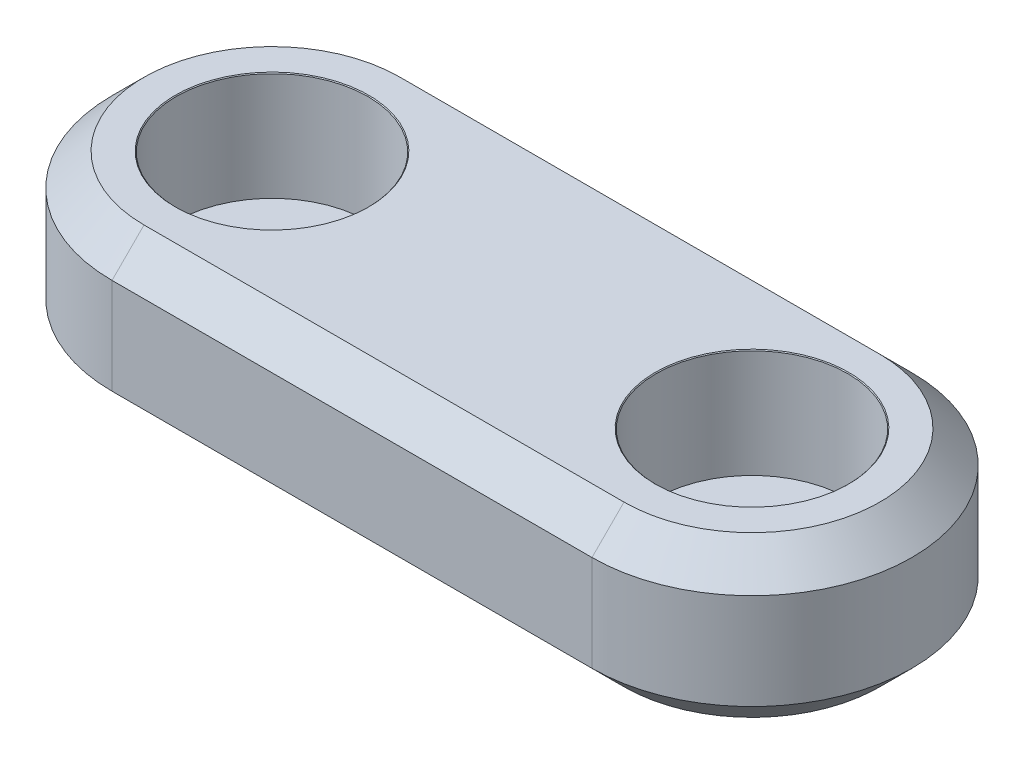
ISO-10303-21;
HEADER;
FILE_DESCRIPTION(('STEP AP214'),'2;1');
FILE_NAME('part.step','',(''),(''),'','','');
FILE_SCHEMA(('AUTOMOTIVE_DESIGN { 1 0 10303 214 1 1 1 1 }'));
ENDSEC;
DATA;
#1=APPLICATION_CONTEXT('core data for automotive mechanical design processes');
#2=APPLICATION_PROTOCOL_DEFINITION('international standard','automotive_design',2000,#1);
#3=PRODUCT_CONTEXT('',#1,'mechanical');
#4=PRODUCT('Part','Part','',(#3));
#5=PRODUCT_RELATED_PRODUCT_CATEGORY('part','',(#4));
#6=PRODUCT_DEFINITION_FORMATION('','',#4);
#7=PRODUCT_DEFINITION_CONTEXT('part definition',#1,'design');
#8=PRODUCT_DEFINITION('design','',#6,#7);
#9=PRODUCT_DEFINITION_SHAPE('','',#8);
#10=(LENGTH_UNIT() NAMED_UNIT(*) SI_UNIT(.MILLI.,.METRE.));
#11=(NAMED_UNIT(*) PLANE_ANGLE_UNIT() SI_UNIT($,.RADIAN.));
#12=(NAMED_UNIT(*) SI_UNIT($,.STERADIAN.) SOLID_ANGLE_UNIT());
#13=UNCERTAINTY_MEASURE_WITH_UNIT(LENGTH_MEASURE(1.E-05),#10,'distance_accuracy_value','');
#14=(GEOMETRIC_REPRESENTATION_CONTEXT(3) GLOBAL_UNCERTAINTY_ASSIGNED_CONTEXT((#13)) GLOBAL_UNIT_ASSIGNED_CONTEXT((#10,
#11,#12)) REPRESENTATION_CONTEXT('',''));
#15=CARTESIAN_POINT('',(0.,0.,0.));
#16=DIRECTION('',(0.,0.,1.));
#17=DIRECTION('',(1.,0.,0.));
#18=AXIS2_PLACEMENT_3D('',#15,#16,#17);
#19=CARTESIAN_POINT('',(-7.5,5.,0.));
#20=DIRECTION('',(0.,-1.,0.));
#21=DIRECTION('',(0.,0.,-1.));
#22=AXIS2_PLACEMENT_3D('',#19,#20,#21);
#23=CYLINDRICAL_SURFACE('',#22,5.);
#24=DIRECTION('',(0.,-1.,0.));
#25=VECTOR('',#24,1.);
#26=CARTESIAN_POINT('',(-7.5,5.,-5.));
#27=LINE('',#26,#25);
#28=CARTESIAN_POINT('',(-7.5,4.,-5.));
#29=VERTEX_POINT('',#28);
#30=CARTESIAN_POINT('',(-7.5,0.999999999999997,-5.));
#31=VERTEX_POINT('',#30);
#32=EDGE_CURVE('E224',#29,#31,#27,.T.);
#33=ORIENTED_EDGE('',*,*,#32,.T.);
#34=CARTESIAN_POINT('',(-7.5,0.999999999999997,0.));
#35=DIRECTION('',(0.,1.,0.));
#36=DIRECTION('',(0.,0.,1.));
#37=AXIS2_PLACEMENT_3D('',#34,#35,#36);
#38=CIRCLE('',#37,5.);
#39=CARTESIAN_POINT('',(-7.5,0.999999999999997,5.));
#40=VERTEX_POINT('',#39);
#41=EDGE_CURVE('E251',#31,#40,#38,.T.);
#42=ORIENTED_EDGE('',*,*,#41,.T.);
#43=DIRECTION('',(0.,-1.,0.));
#44=VECTOR('',#43,1.);
#45=CARTESIAN_POINT('',(-7.5,5.,5.));
#46=LINE('',#45,#44);
#47=CARTESIAN_POINT('',(-7.5,4.,5.));
#48=VERTEX_POINT('',#47);
#49=EDGE_CURVE('E137',#48,#40,#46,.T.);
#50=ORIENTED_EDGE('',*,*,#49,.F.);
#51=CARTESIAN_POINT('',(-7.5,4.,0.));
#52=DIRECTION('',(0.,1.,0.));
#53=DIRECTION('',(0.,0.,1.));
#54=AXIS2_PLACEMENT_3D('',#51,#52,#53);
#55=CIRCLE('',#54,5.);
#56=EDGE_CURVE('E248',#48,#29,#55,.F.);
#57=ORIENTED_EDGE('',*,*,#56,.T.);
#58=EDGE_LOOP('',(#33,#42,#50,#57));
#59=FACE_BOUND('',#58,.T.);
#60=ADVANCED_FACE('F42',(#59),#23,.T.);
#61=CARTESIAN_POINT('',(-7.5,5.,5.));
#62=DIRECTION('',(0.,0.,-1.));
#63=DIRECTION('',(-1.,0.,0.));
#64=AXIS2_PLACEMENT_3D('',#61,#62,#63);
#65=PLANE('',#64);
#66=ORIENTED_EDGE('',*,*,#49,.T.);
#67=DIRECTION('',(1.,0.,0.));
#68=VECTOR('',#67,1.);
#69=CARTESIAN_POINT('',(-7.5,0.999999999999997,5.));
#70=LINE('',#69,#68);
#71=CARTESIAN_POINT('',(7.5,0.999999999999997,5.));
#72=VERTEX_POINT('',#71);
#73=EDGE_CURVE('E135',#40,#72,#70,.T.);
#74=ORIENTED_EDGE('',*,*,#73,.T.);
#75=DIRECTION('',(0.,-1.,0.));
#76=VECTOR('',#75,1.);
#77=CARTESIAN_POINT('',(7.5,5.,5.));
#78=LINE('',#77,#76);
#79=CARTESIAN_POINT('',(7.5,4.,5.));
#80=VERTEX_POINT('',#79);
#81=EDGE_CURVE('E117',#80,#72,#78,.T.);
#82=ORIENTED_EDGE('',*,*,#81,.F.);
#83=DIRECTION('',(-1.,0.,0.));
#84=VECTOR('',#83,1.);
#85=CARTESIAN_POINT('',(-7.5,4.,5.));
#86=LINE('',#85,#84);
#87=EDGE_CURVE('E132',#80,#48,#86,.T.);
#88=ORIENTED_EDGE('',*,*,#87,.T.);
#89=EDGE_LOOP('',(#66,#74,#82,#88));
#90=FACE_BOUND('',#89,.T.);
#91=ADVANCED_FACE('F131',(#90),#65,.F.);
#92=CARTESIAN_POINT('',(7.5,5.,0.));
#93=DIRECTION('',(0.,-1.,0.));
#94=DIRECTION('',(0.,0.,-1.));
#95=AXIS2_PLACEMENT_3D('',#92,#93,#94);
#96=CYLINDRICAL_SURFACE('',#95,5.);
#97=ORIENTED_EDGE('',*,*,#81,.T.);
#98=CARTESIAN_POINT('',(7.5,0.999999999999997,0.));
#99=DIRECTION('',(0.,1.,0.));
#100=DIRECTION('',(0.,0.,1.));
#101=AXIS2_PLACEMENT_3D('',#98,#99,#100);
#102=CIRCLE('',#101,5.);
#103=CARTESIAN_POINT('',(7.5,0.999999999999997,-5.));
#104=VERTEX_POINT('',#103);
#105=EDGE_CURVE('E124',#72,#104,#102,.T.);
#106=ORIENTED_EDGE('',*,*,#105,.T.);
#107=DIRECTION('',(0.,-1.,0.));
#108=VECTOR('',#107,1.);
#109=CARTESIAN_POINT('',(7.5,5.,-5.));
#110=LINE('',#109,#108);
#111=CARTESIAN_POINT('',(7.5,4.,-5.));
#112=VERTEX_POINT('',#111);
#113=EDGE_CURVE('E119',#112,#104,#110,.T.);
#114=ORIENTED_EDGE('',*,*,#113,.F.);
#115=CARTESIAN_POINT('',(7.5,4.,0.));
#116=DIRECTION('',(0.,1.,0.));
#117=DIRECTION('',(0.,0.,1.));
#118=AXIS2_PLACEMENT_3D('',#115,#116,#117);
#119=CIRCLE('',#118,5.);
#120=EDGE_CURVE('E114',#112,#80,#119,.F.);
#121=ORIENTED_EDGE('',*,*,#120,.T.);
#122=EDGE_LOOP('',(#97,#106,#114,#121));
#123=FACE_BOUND('',#122,.T.);
#124=ADVANCED_FACE('F116',(#123),#96,.T.);
#125=CARTESIAN_POINT('',(-7.5,5.,-5.));
#126=DIRECTION('',(0.,0.,1.));
#127=DIRECTION('',(1.,0.,0.));
#128=AXIS2_PLACEMENT_3D('',#125,#126,#127);
#129=PLANE('',#128);
#130=ORIENTED_EDGE('',*,*,#113,.T.);
#131=DIRECTION('',(-1.,0.,0.));
#132=VECTOR('',#131,1.);
#133=CARTESIAN_POINT('',(-7.5,0.999999999999997,-5.));
#134=LINE('',#133,#132);
#135=EDGE_CURVE('E257',#104,#31,#134,.T.);
#136=ORIENTED_EDGE('',*,*,#135,.T.);
#137=ORIENTED_EDGE('',*,*,#32,.F.);
#138=DIRECTION('',(1.,0.,0.));
#139=VECTOR('',#138,1.);
#140=CARTESIAN_POINT('',(7.5,4.,-5.));
#141=LINE('',#140,#139);
#142=EDGE_CURVE('E254',#29,#112,#141,.T.);
#143=ORIENTED_EDGE('',*,*,#142,.T.);
#144=EDGE_LOOP('',(#130,#136,#137,#143));
#145=FACE_BOUND('',#144,.T.);
#146=ADVANCED_FACE('F274',(#145),#129,.F.);
#147=CARTESIAN_POINT('',(-7.5,5.,0.));
#148=DIRECTION('',(0.,1.,0.));
#149=DIRECTION('',(0.,0.,1.));
#150=AXIS2_PLACEMENT_3D('',#147,#148,#149);
#151=PLANE('',#150);
#152=CARTESIAN_POINT('',(-7.5,5.,0.));
#153=DIRECTION('',(0.,1.,0.));
#154=DIRECTION('',(0.,0.,1.));
#155=AXIS2_PLACEMENT_3D('',#152,#153,#154);
#156=CIRCLE('',#155,4.);
#157=CARTESIAN_POINT('',(-7.5,5.,-4.));
#158=VERTEX_POINT('',#157);
#159=CARTESIAN_POINT('',(-7.5,5.,4.));
#160=VERTEX_POINT('',#159);
#161=EDGE_CURVE('E68',#158,#160,#156,.T.);
#162=ORIENTED_EDGE('',*,*,#161,.T.);
#163=DIRECTION('',(1.,0.,0.));
#164=VECTOR('',#163,1.);
#165=CARTESIAN_POINT('',(7.5,5.,4.));
#166=LINE('',#165,#164);
#167=CARTESIAN_POINT('',(7.5,5.,4.));
#168=VERTEX_POINT('',#167);
#169=EDGE_CURVE('E11',#160,#168,#166,.T.);
#170=ORIENTED_EDGE('',*,*,#169,.T.);
#171=CARTESIAN_POINT('',(7.5,5.,0.));
#172=DIRECTION('',(0.,1.,0.));
#173=DIRECTION('',(0.,0.,1.));
#174=AXIS2_PLACEMENT_3D('',#171,#172,#173);
#175=CIRCLE('',#174,4.);
#176=CARTESIAN_POINT('',(7.5,5.,-4.));
#177=VERTEX_POINT('',#176);
#178=EDGE_CURVE('E53',#168,#177,#175,.T.);
#179=ORIENTED_EDGE('',*,*,#178,.T.);
#180=DIRECTION('',(-1.,0.,0.));
#181=VECTOR('',#180,1.);
#182=CARTESIAN_POINT('',(-7.5,5.,-4.));
#183=LINE('',#182,#181);
#184=EDGE_CURVE('E260',#177,#158,#183,.T.);
#185=ORIENTED_EDGE('',*,*,#184,.T.);
#186=EDGE_LOOP('',(#162,#170,#179,#185));
#187=FACE_BOUND('',#186,.T.);
#188=CARTESIAN_POINT('',(-7.5,5.,0.));
#189=DIRECTION('',(0.,1.,0.));
#190=DIRECTION('',(0.,0.,1.));
#191=AXIS2_PLACEMENT_3D('',#188,#189,#190);
#192=CIRCLE('',#191,3.025);
#193=CARTESIAN_POINT('',(-7.5,5.,3.025));
#194=VERTEX_POINT('',#193);
#195=EDGE_CURVE('E177',#194,#194,#192,.T.);
#196=ORIENTED_EDGE('',*,*,#195,.F.);
#197=EDGE_LOOP('',(#196));
#198=FACE_BOUND('',#197,.T.);
#199=CARTESIAN_POINT('',(7.5,5.,0.));
#200=DIRECTION('',(0.,1.,0.));
#201=DIRECTION('',(0.,0.,1.));
#202=AXIS2_PLACEMENT_3D('',#199,#200,#201);
#203=CIRCLE('',#202,3.025);
#204=CARTESIAN_POINT('',(7.5,5.,3.025));
#205=VERTEX_POINT('',#204);
#206=EDGE_CURVE('E204',#205,#205,#203,.T.);
#207=ORIENTED_EDGE('',*,*,#206,.F.);
#208=EDGE_LOOP('',(#207));
#209=FACE_BOUND('',#208,.T.);
#210=ADVANCED_FACE('F266',(#187,#198,#209),#151,.T.);
#211=CARTESIAN_POINT('',(-7.5,0.,0.));
#212=DIRECTION('',(0.,1.,0.));
#213=DIRECTION('',(0.,0.,1.));
#214=AXIS2_PLACEMENT_3D('',#211,#212,#213);
#215=PLANE('',#214);
#216=CARTESIAN_POINT('',(7.5,0.,0.));
#217=DIRECTION('',(0.,1.,0.));
#218=DIRECTION('',(0.,0.,1.));
#219=AXIS2_PLACEMENT_3D('',#216,#217,#218);
#220=CIRCLE('',#219,3.99999999999999);
#221=CARTESIAN_POINT('',(7.5,0.,-4.));
#222=VERTEX_POINT('',#221);
#223=CARTESIAN_POINT('',(7.5,0.,3.99999999999999));
#224=VERTEX_POINT('',#223);
#225=EDGE_CURVE('E240',#222,#224,#220,.F.);
#226=ORIENTED_EDGE('',*,*,#225,.T.);
#227=DIRECTION('',(-1.,0.,0.));
#228=VECTOR('',#227,1.);
#229=CARTESIAN_POINT('',(-7.5,0.,3.99999999999999));
#230=LINE('',#229,#228);
#231=CARTESIAN_POINT('',(-7.5,0.,4.));
#232=VERTEX_POINT('',#231);
#233=EDGE_CURVE('E125',#224,#232,#230,.T.);
#234=ORIENTED_EDGE('',*,*,#233,.T.);
#235=CARTESIAN_POINT('',(-7.5,0.,0.));
#236=DIRECTION('',(0.,1.,0.));
#237=DIRECTION('',(0.,0.,1.));
#238=AXIS2_PLACEMENT_3D('',#235,#236,#237);
#239=CIRCLE('',#238,3.99999999999999);
#240=CARTESIAN_POINT('',(-7.5,0.,-3.99999999999999));
#241=VERTEX_POINT('',#240);
#242=EDGE_CURVE('E237',#232,#241,#239,.F.);
#243=ORIENTED_EDGE('',*,*,#242,.T.);
#244=DIRECTION('',(1.,0.,0.));
#245=VECTOR('',#244,1.);
#246=CARTESIAN_POINT('',(-7.5,0.,-3.99999999999999));
#247=LINE('',#246,#245);
#248=EDGE_CURVE('E234',#241,#222,#247,.T.);
#249=ORIENTED_EDGE('',*,*,#248,.T.);
#250=EDGE_LOOP('',(#226,#234,#243,#249));
#251=FACE_BOUND('',#250,.T.);
#252=CARTESIAN_POINT('',(-7.5,0.,0.));
#253=DIRECTION('',(0.,1.,0.));
#254=DIRECTION('',(0.,0.,1.));
#255=AXIS2_PLACEMENT_3D('',#252,#253,#254);
#256=CIRCLE('',#255,1.6);
#257=CARTESIAN_POINT('',(-7.5,0.,1.6));
#258=VERTEX_POINT('',#257);
#259=EDGE_CURVE('E200',#258,#258,#256,.T.);
#260=ORIENTED_EDGE('',*,*,#259,.T.);
#261=EDGE_LOOP('',(#260));
#262=FACE_BOUND('',#261,.T.);
#263=CARTESIAN_POINT('',(7.5,0.,0.));
#264=DIRECTION('',(0.,1.,0.));
#265=DIRECTION('',(0.,0.,1.));
#266=AXIS2_PLACEMENT_3D('',#263,#264,#265);
#267=CIRCLE('',#266,1.6);
#268=CARTESIAN_POINT('',(7.5,0.,1.6));
#269=VERTEX_POINT('',#268);
#270=EDGE_CURVE('E220',#269,#269,#267,.T.);
#271=ORIENTED_EDGE('',*,*,#270,.T.);
#272=EDGE_LOOP('',(#271));
#273=FACE_BOUND('',#272,.T.);
#274=ADVANCED_FACE('F302',(#251,#262,#273),#215,.F.);
#275=CARTESIAN_POINT('',(7.5,5.,0.));
#276=DIRECTION('',(0.,1.,0.));
#277=DIRECTION('',(0.,0.,1.));
#278=AXIS2_PLACEMENT_3D('',#275,#276,#277);
#279=CYLINDRICAL_SURFACE('',#278,1.6);
#280=ORIENTED_EDGE('',*,*,#270,.F.);
#281=EDGE_LOOP('',(#280));
#282=FACE_BOUND('',#281,.T.);
#283=CARTESIAN_POINT('',(7.5,1.6,0.));
#284=DIRECTION('',(0.,1.,0.));
#285=DIRECTION('',(0.,0.,1.));
#286=AXIS2_PLACEMENT_3D('',#283,#284,#285);
#287=CIRCLE('',#286,1.6);
#288=CARTESIAN_POINT('',(7.5,1.6,1.6));
#289=VERTEX_POINT('',#288);
#290=EDGE_CURVE('E216',#289,#289,#287,.T.);
#291=ORIENTED_EDGE('',*,*,#290,.T.);
#292=EDGE_LOOP('',(#291));
#293=FACE_BOUND('',#292,.T.);
#294=ADVANCED_FACE('F305',(#282,#293),#279,.F.);
#295=CARTESIAN_POINT('',(10.5,1.6,0.));
#296=DIRECTION('',(0.,-1.,0.));
#297=DIRECTION('',(0.,0.,-1.));
#298=AXIS2_PLACEMENT_3D('',#295,#296,#297);
#299=PLANE('',#298);
#300=ORIENTED_EDGE('',*,*,#290,.F.);
#301=EDGE_LOOP('',(#300));
#302=FACE_BOUND('',#301,.T.);
#303=CARTESIAN_POINT('',(7.5,1.6,0.));
#304=DIRECTION('',(0.,1.,0.));
#305=DIRECTION('',(0.,0.,1.));
#306=AXIS2_PLACEMENT_3D('',#303,#304,#305);
#307=CIRCLE('',#306,3.);
#308=CARTESIAN_POINT('',(7.5,1.6,3.));
#309=VERTEX_POINT('',#308);
#310=EDGE_CURVE('E212',#309,#309,#307,.T.);
#311=ORIENTED_EDGE('',*,*,#310,.T.);
#312=EDGE_LOOP('',(#311));
#313=FACE_BOUND('',#312,.T.);
#314=ADVANCED_FACE('F311',(#302,#313),#299,.F.);
#315=CARTESIAN_POINT('',(7.5,5.,0.));
#316=DIRECTION('',(0.,1.,0.));
#317=DIRECTION('',(0.,0.,1.));
#318=AXIS2_PLACEMENT_3D('',#315,#316,#317);
#319=CYLINDRICAL_SURFACE('',#318,3.);
#320=ORIENTED_EDGE('',*,*,#310,.F.);
#321=EDGE_LOOP('',(#320));
#322=FACE_BOUND('',#321,.T.);
#323=CARTESIAN_POINT('',(7.5,4.975,0.));
#324=DIRECTION('',(0.,1.,0.));
#325=DIRECTION('',(0.,0.,1.));
#326=AXIS2_PLACEMENT_3D('',#323,#324,#325);
#327=CIRCLE('',#326,3.);
#328=CARTESIAN_POINT('',(7.5,4.975,3.));
#329=VERTEX_POINT('',#328);
#330=EDGE_CURVE('E208',#329,#329,#327,.T.);
#331=ORIENTED_EDGE('',*,*,#330,.T.);
#332=EDGE_LOOP('',(#331));
#333=FACE_BOUND('',#332,.T.);
#334=ADVANCED_FACE('F315',(#322,#333),#319,.F.);
#335=CARTESIAN_POINT('',(7.5,5.,0.));
#336=DIRECTION('',(0.,1.,0.));
#337=DIRECTION('',(0.,0.,1.));
#338=AXIS2_PLACEMENT_3D('',#335,#336,#337);
#339=CONICAL_SURFACE('',#338,3.025,0.785398163397396);
#340=ORIENTED_EDGE('',*,*,#330,.F.);
#341=EDGE_LOOP('',(#340));
#342=FACE_BOUND('',#341,.T.);
#343=ORIENTED_EDGE('',*,*,#206,.T.);
#344=EDGE_LOOP('',(#343));
#345=FACE_BOUND('',#344,.T.);
#346=ADVANCED_FACE('F319',(#342,#345),#339,.F.);
#347=CARTESIAN_POINT('',(-7.5,5.,0.));
#348=DIRECTION('',(0.,1.,0.));
#349=DIRECTION('',(0.,0.,1.));
#350=AXIS2_PLACEMENT_3D('',#347,#348,#349);
#351=CYLINDRICAL_SURFACE('',#350,1.6);
#352=ORIENTED_EDGE('',*,*,#259,.F.);
#353=EDGE_LOOP('',(#352));
#354=FACE_BOUND('',#353,.T.);
#355=CARTESIAN_POINT('',(-7.5,1.6,0.));
#356=DIRECTION('',(0.,1.,0.));
#357=DIRECTION('',(0.,0.,1.));
#358=AXIS2_PLACEMENT_3D('',#355,#356,#357);
#359=CIRCLE('',#358,1.6);
#360=CARTESIAN_POINT('',(-7.5,1.6,1.6));
#361=VERTEX_POINT('',#360);
#362=EDGE_CURVE('E196',#361,#361,#359,.T.);
#363=ORIENTED_EDGE('',*,*,#362,.T.);
#364=EDGE_LOOP('',(#363));
#365=FACE_BOUND('',#364,.T.);
#366=ADVANCED_FACE('F323',(#354,#365),#351,.F.);
#367=CARTESIAN_POINT('',(-4.5,1.6,0.));
#368=DIRECTION('',(0.,-1.,0.));
#369=DIRECTION('',(0.,0.,-1.));
#370=AXIS2_PLACEMENT_3D('',#367,#368,#369);
#371=PLANE('',#370);
#372=ORIENTED_EDGE('',*,*,#362,.F.);
#373=EDGE_LOOP('',(#372));
#374=FACE_BOUND('',#373,.T.);
#375=CARTESIAN_POINT('',(-7.5,1.6,0.));
#376=DIRECTION('',(0.,1.,0.));
#377=DIRECTION('',(0.,0.,1.));
#378=AXIS2_PLACEMENT_3D('',#375,#376,#377);
#379=CIRCLE('',#378,3.);
#380=CARTESIAN_POINT('',(-7.5,1.6,3.));
#381=VERTEX_POINT('',#380);
#382=EDGE_CURVE('E190',#381,#381,#379,.T.);
#383=ORIENTED_EDGE('',*,*,#382,.T.);
#384=EDGE_LOOP('',(#383));
#385=FACE_BOUND('',#384,.T.);
#386=ADVANCED_FACE('F327',(#374,#385),#371,.F.);
#387=CARTESIAN_POINT('',(-7.5,5.,0.));
#388=DIRECTION('',(0.,1.,0.));
#389=DIRECTION('',(0.,0.,1.));
#390=AXIS2_PLACEMENT_3D('',#387,#388,#389);
#391=CYLINDRICAL_SURFACE('',#390,3.);
#392=ORIENTED_EDGE('',*,*,#382,.F.);
#393=EDGE_LOOP('',(#392));
#394=FACE_BOUND('',#393,.T.);
#395=CARTESIAN_POINT('',(-7.5,4.975,0.));
#396=DIRECTION('',(0.,1.,0.));
#397=DIRECTION('',(0.,0.,1.));
#398=AXIS2_PLACEMENT_3D('',#395,#396,#397);
#399=CIRCLE('',#398,3.);
#400=CARTESIAN_POINT('',(-7.5,4.975,3.));
#401=VERTEX_POINT('',#400);
#402=EDGE_CURVE('E184',#401,#401,#399,.T.);
#403=ORIENTED_EDGE('',*,*,#402,.T.);
#404=EDGE_LOOP('',(#403));
#405=FACE_BOUND('',#404,.T.);
#406=ADVANCED_FACE('F331',(#394,#405),#391,.F.);
#407=CARTESIAN_POINT('',(-7.5,5.,0.));
#408=DIRECTION('',(0.,1.,0.));
#409=DIRECTION('',(0.,0.,1.));
#410=AXIS2_PLACEMENT_3D('',#407,#408,#409);
#411=CONICAL_SURFACE('',#410,3.025,0.785398163397396);
#412=ORIENTED_EDGE('',*,*,#402,.F.);
#413=EDGE_LOOP('',(#412));
#414=FACE_BOUND('',#413,.T.);
#415=ORIENTED_EDGE('',*,*,#195,.T.);
#416=EDGE_LOOP('',(#415));
#417=FACE_BOUND('',#416,.T.);
#418=ADVANCED_FACE('F335',(#414,#417),#411,.F.);
#419=CARTESIAN_POINT('',(-7.5,0.999999999999997,-5.));
#420=DIRECTION('',(0.,0.70710678118655,0.707106781186545));
#421=DIRECTION('',(-1.,0.,0.));
#422=AXIS2_PLACEMENT_3D('',#419,#420,#421);
#423=PLANE('',#422);
#424=DIRECTION('',(0.,0.707106781186545,-0.70710678118655));
#425=VECTOR('',#424,1.);
#426=CARTESIAN_POINT('',(7.5,0.,-4.));
#427=LINE('',#426,#425);
#428=EDGE_CURVE('E167',#222,#104,#427,.T.);
#429=ORIENTED_EDGE('',*,*,#428,.F.);
#430=ORIENTED_EDGE('',*,*,#248,.F.);
#431=DIRECTION('',(0.,-0.707106781186545,0.70710678118655));
#432=VECTOR('',#431,1.);
#433=CARTESIAN_POINT('',(-7.5,0.999999999999997,-5.));
#434=LINE('',#433,#432);
#435=EDGE_CURVE('E151',#31,#241,#434,.T.);
#436=ORIENTED_EDGE('',*,*,#435,.F.);
#437=ORIENTED_EDGE('',*,*,#135,.F.);
#438=EDGE_LOOP('',(#429,#430,#436,#437));
#439=FACE_BOUND('',#438,.T.);
#440=ADVANCED_FACE('F277',(#439),#423,.F.);
#441=CARTESIAN_POINT('',(-7.5,0.999999999999997,0.));
#442=DIRECTION('',(0.,1.,0.));
#443=DIRECTION('',(0.,0.,1.));
#444=AXIS2_PLACEMENT_3D('',#441,#442,#443);
#445=CONICAL_SURFACE('',#444,5.,0.785398163397452);
#446=ORIENTED_EDGE('',*,*,#435,.T.);
#447=ORIENTED_EDGE('',*,*,#242,.F.);
#448=DIRECTION('',(0.,-0.707106781186545,-0.70710678118655));
#449=VECTOR('',#448,1.);
#450=CARTESIAN_POINT('',(-7.5,0.999999999999997,5.));
#451=LINE('',#450,#449);
#452=EDGE_CURVE('E160',#40,#232,#451,.T.);
#453=ORIENTED_EDGE('',*,*,#452,.F.);
#454=ORIENTED_EDGE('',*,*,#41,.F.);
#455=EDGE_LOOP('',(#446,#447,#453,#454));
#456=FACE_BOUND('',#455,.T.);
#457=ADVANCED_FACE('F280',(#456),#445,.T.);
#458=CARTESIAN_POINT('',(7.5,0.999999999999997,0.));
#459=DIRECTION('',(0.,1.,0.));
#460=DIRECTION('',(0.,0.,1.));
#461=AXIS2_PLACEMENT_3D('',#458,#459,#460);
#462=CONICAL_SURFACE('',#461,5.,0.785398163397452);
#463=ORIENTED_EDGE('',*,*,#428,.T.);
#464=ORIENTED_EDGE('',*,*,#105,.F.);
#465=DIRECTION('',(0.,0.707106781186545,0.70710678118655));
#466=VECTOR('',#465,1.);
#467=CARTESIAN_POINT('',(7.5,0.,3.99999999999999));
#468=LINE('',#467,#466);
#469=EDGE_CURVE('E156',#224,#72,#468,.T.);
#470=ORIENTED_EDGE('',*,*,#469,.F.);
#471=ORIENTED_EDGE('',*,*,#225,.F.);
#472=EDGE_LOOP('',(#463,#464,#470,#471));
#473=FACE_BOUND('',#472,.T.);
#474=ADVANCED_FACE('F283',(#473),#462,.T.);
#475=CARTESIAN_POINT('',(-7.5,0.999999999999997,5.));
#476=DIRECTION('',(0.,0.70710678118655,-0.707106781186545));
#477=DIRECTION('',(1.,0.,0.));
#478=AXIS2_PLACEMENT_3D('',#475,#476,#477);
#479=PLANE('',#478);
#480=ORIENTED_EDGE('',*,*,#452,.T.);
#481=ORIENTED_EDGE('',*,*,#233,.F.);
#482=ORIENTED_EDGE('',*,*,#469,.T.);
#483=ORIENTED_EDGE('',*,*,#73,.F.);
#484=EDGE_LOOP('',(#480,#481,#482,#483));
#485=FACE_BOUND('',#484,.T.);
#486=ADVANCED_FACE('F281',(#485),#479,.F.);
#487=CARTESIAN_POINT('',(-7.5,5.,-4.));
#488=DIRECTION('',(0.,0.707106781186545,-0.70710678118655));
#489=DIRECTION('',(1.,0.,0.));
#490=AXIS2_PLACEMENT_3D('',#487,#488,#489);
#491=PLANE('',#490);
#492=DIRECTION('',(0.,0.70710678118655,0.707106781186545));
#493=VECTOR('',#492,1.);
#494=CARTESIAN_POINT('',(7.5,4.,-5.));
#495=LINE('',#494,#493);
#496=EDGE_CURVE('E148',#112,#177,#495,.T.);
#497=ORIENTED_EDGE('',*,*,#496,.F.);
#498=ORIENTED_EDGE('',*,*,#142,.F.);
#499=DIRECTION('',(0.,-0.70710678118655,-0.707106781186545));
#500=VECTOR('',#499,1.);
#501=CARTESIAN_POINT('',(-7.5,5.,-4.));
#502=LINE('',#501,#500);
#503=EDGE_CURVE('E47',#158,#29,#502,.T.);
#504=ORIENTED_EDGE('',*,*,#503,.F.);
#505=ORIENTED_EDGE('',*,*,#184,.F.);
#506=EDGE_LOOP('',(#497,#498,#504,#505));
#507=FACE_BOUND('',#506,.T.);
#508=ADVANCED_FACE('F45',(#507),#491,.T.);
#509=CARTESIAN_POINT('',(-7.5,5.,0.));
#510=DIRECTION('',(0.,-1.,0.));
#511=DIRECTION('',(0.,0.,-1.));
#512=AXIS2_PLACEMENT_3D('',#509,#510,#511);
#513=CONICAL_SURFACE('',#512,4.,0.785398163397445);
#514=ORIENTED_EDGE('',*,*,#503,.T.);
#515=ORIENTED_EDGE('',*,*,#56,.F.);
#516=DIRECTION('',(0.,-0.70710678118655,0.707106781186545));
#517=VECTOR('',#516,1.);
#518=CARTESIAN_POINT('',(-7.5,5.,4.));
#519=LINE('',#518,#517);
#520=EDGE_CURVE('E140',#160,#48,#519,.T.);
#521=ORIENTED_EDGE('',*,*,#520,.F.);
#522=ORIENTED_EDGE('',*,*,#161,.F.);
#523=EDGE_LOOP('',(#514,#515,#521,#522));
#524=FACE_BOUND('',#523,.T.);
#525=ADVANCED_FACE('F270',(#524),#513,.T.);
#526=CARTESIAN_POINT('',(7.5,5.,0.));
#527=DIRECTION('',(0.,-1.,0.));
#528=DIRECTION('',(0.,0.,-1.));
#529=AXIS2_PLACEMENT_3D('',#526,#527,#528);
#530=CONICAL_SURFACE('',#529,4.,0.785398163397445);
#531=ORIENTED_EDGE('',*,*,#496,.T.);
#532=ORIENTED_EDGE('',*,*,#178,.F.);
#533=DIRECTION('',(0.,0.70710678118655,-0.707106781186545));
#534=VECTOR('',#533,1.);
#535=CARTESIAN_POINT('',(7.5,4.,5.));
#536=LINE('',#535,#534);
#537=EDGE_CURVE('E61',#80,#168,#536,.T.);
#538=ORIENTED_EDGE('',*,*,#537,.F.);
#539=ORIENTED_EDGE('',*,*,#120,.F.);
#540=EDGE_LOOP('',(#531,#532,#538,#539));
#541=FACE_BOUND('',#540,.T.);
#542=ADVANCED_FACE('F144',(#541),#530,.T.);
#543=CARTESIAN_POINT('',(-7.5,5.,4.));
#544=DIRECTION('',(0.,0.707106781186545,0.70710678118655));
#545=DIRECTION('',(-1.,0.,0.));
#546=AXIS2_PLACEMENT_3D('',#543,#544,#545);
#547=PLANE('',#546);
#548=ORIENTED_EDGE('',*,*,#520,.T.);
#549=ORIENTED_EDGE('',*,*,#87,.F.);
#550=ORIENTED_EDGE('',*,*,#537,.T.);
#551=ORIENTED_EDGE('',*,*,#169,.F.);
#552=EDGE_LOOP('',(#548,#549,#550,#551));
#553=FACE_BOUND('',#552,.T.);
#554=ADVANCED_FACE('F139',(#553),#547,.T.);
#555=CLOSED_SHELL('',(#60,#91,#124,#146,#210,#274,#294,#314,#334,#346,#366,#386,#406,#418,#440,
#457,#474,#486,#508,#525,#542,#554));
#556=MANIFOLD_SOLID_BREP('B2',#555);
#557=ADVANCED_BREP_SHAPE_REPRESENTATION('',(#18,#556),#14);
#558=SHAPE_DEFINITION_REPRESENTATION(#9,#557);
ENDSEC;
END-ISO-10303-21;
